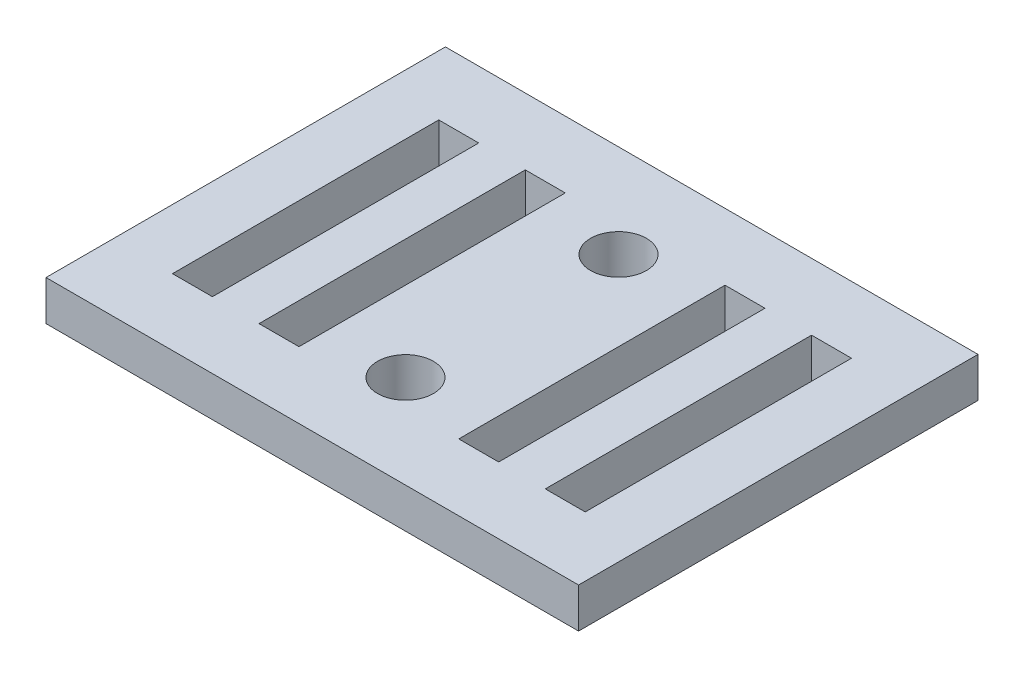
ISO-10303-21;
HEADER;
FILE_DESCRIPTION(('STEP AP214'),'2;1');
FILE_NAME('part.step','',(''),(''),'','','');
FILE_SCHEMA(('AUTOMOTIVE_DESIGN { 1 0 10303 214 1 1 1 1 }'));
ENDSEC;
DATA;
#1=APPLICATION_CONTEXT('core data for automotive mechanical design processes');
#2=APPLICATION_PROTOCOL_DEFINITION('international standard','automotive_design',2000,#1);
#3=PRODUCT_CONTEXT('',#1,'mechanical');
#4=PRODUCT('Part','Part','',(#3));
#5=PRODUCT_RELATED_PRODUCT_CATEGORY('part','',(#4));
#6=PRODUCT_DEFINITION_FORMATION('','',#4);
#7=PRODUCT_DEFINITION_CONTEXT('part definition',#1,'design');
#8=PRODUCT_DEFINITION('design','',#6,#7);
#9=PRODUCT_DEFINITION_SHAPE('','',#8);
#10=(LENGTH_UNIT() NAMED_UNIT(*) SI_UNIT(.MILLI.,.METRE.));
#11=(NAMED_UNIT(*) PLANE_ANGLE_UNIT() SI_UNIT($,.RADIAN.));
#12=(NAMED_UNIT(*) SI_UNIT($,.STERADIAN.) SOLID_ANGLE_UNIT());
#13=UNCERTAINTY_MEASURE_WITH_UNIT(LENGTH_MEASURE(1.E-05),#10,'distance_accuracy_value','');
#14=(GEOMETRIC_REPRESENTATION_CONTEXT(3) GLOBAL_UNCERTAINTY_ASSIGNED_CONTEXT((#13)) GLOBAL_UNIT_ASSIGNED_CONTEXT((#10,
#11,#12)) REPRESENTATION_CONTEXT('',''));
#15=CARTESIAN_POINT('',(0.,0.,0.));
#16=DIRECTION('',(0.,0.,1.));
#17=DIRECTION('',(1.,0.,0.));
#18=AXIS2_PLACEMENT_3D('',#15,#16,#17);
#19=CARTESIAN_POINT('',(0.,3.,25.0000000000001));
#20=DIRECTION('',(0.,0.,1.));
#21=DIRECTION('',(1.,0.,0.));
#22=AXIS2_PLACEMENT_3D('',#19,#20,#21);
#23=PLANE('',#22);
#24=DIRECTION('',(-1.,0.,0.));
#25=VECTOR('',#24,1.);
#26=CARTESIAN_POINT('',(0.,0.,25.0000000000001));
#27=LINE('',#26,#25);
#28=CARTESIAN_POINT('',(35.5,0.,25.));
#29=VERTEX_POINT('',#28);
#30=CARTESIAN_POINT('',(32.5,0.,25.));
#31=VERTEX_POINT('',#30);
#32=EDGE_CURVE('E287',#29,#31,#27,.T.);
#33=ORIENTED_EDGE('',*,*,#32,.T.);
#34=DIRECTION('',(0.,-1.,0.));
#35=VECTOR('',#34,1.);
#36=CARTESIAN_POINT('',(32.5,3.,25.));
#37=LINE('',#36,#35);
#38=CARTESIAN_POINT('',(32.5,3.,25.));
#39=VERTEX_POINT('',#38);
#40=EDGE_CURVE('E11',#39,#31,#37,.T.);
#41=ORIENTED_EDGE('',*,*,#40,.F.);
#42=DIRECTION('',(-1.,0.,0.));
#43=VECTOR('',#42,1.);
#44=CARTESIAN_POINT('',(0.,3.,25.0000000000001));
#45=LINE('',#44,#43);
#46=CARTESIAN_POINT('',(35.5,3.,25.));
#47=VERTEX_POINT('',#46);
#48=EDGE_CURVE('E204',#47,#39,#45,.T.);
#49=ORIENTED_EDGE('',*,*,#48,.F.);
#50=DIRECTION('',(0.,-1.,0.));
#51=VECTOR('',#50,1.);
#52=CARTESIAN_POINT('',(35.5,3.,25.));
#53=LINE('',#52,#51);
#54=EDGE_CURVE('E299',#47,#29,#53,.T.);
#55=ORIENTED_EDGE('',*,*,#54,.T.);
#56=EDGE_LOOP('',(#33,#41,#49,#55));
#57=FACE_BOUND('',#56,.T.);
#58=ADVANCED_FACE('F45',(#57),#23,.F.);
#59=CARTESIAN_POINT('',(32.5,3.,0.));
#60=DIRECTION('',(1.,0.,0.));
#61=DIRECTION('',(0.,0.,-1.));
#62=AXIS2_PLACEMENT_3D('',#59,#60,#61);
#63=PLANE('',#62);
#64=DIRECTION('',(0.,0.,1.));
#65=VECTOR('',#64,1.);
#66=CARTESIAN_POINT('',(32.5,0.,0.));
#67=LINE('',#66,#65);
#68=CARTESIAN_POINT('',(32.5,0.,5.));
#69=VERTEX_POINT('',#68);
#70=EDGE_CURVE('E194',#69,#31,#67,.T.);
#71=ORIENTED_EDGE('',*,*,#70,.F.);
#72=DIRECTION('',(0.,-1.,0.));
#73=VECTOR('',#72,1.);
#74=CARTESIAN_POINT('',(32.5,3.,5.));
#75=LINE('',#74,#73);
#76=CARTESIAN_POINT('',(32.5,3.,5.));
#77=VERTEX_POINT('',#76);
#78=EDGE_CURVE('E56',#77,#69,#75,.T.);
#79=ORIENTED_EDGE('',*,*,#78,.F.);
#80=DIRECTION('',(0.,0.,1.));
#81=VECTOR('',#80,1.);
#82=CARTESIAN_POINT('',(32.5,3.,0.));
#83=LINE('',#82,#81);
#84=EDGE_CURVE('E192',#77,#39,#83,.T.);
#85=ORIENTED_EDGE('',*,*,#84,.T.);
#86=ORIENTED_EDGE('',*,*,#40,.T.);
#87=EDGE_LOOP('',(#71,#79,#85,#86));
#88=FACE_BOUND('',#87,.T.);
#89=ADVANCED_FACE('F191',(#88),#63,.T.);
#90=CARTESIAN_POINT('',(0.,3.,5.));
#91=DIRECTION('',(0.,0.,1.));
#92=DIRECTION('',(1.,0.,0.));
#93=AXIS2_PLACEMENT_3D('',#90,#91,#92);
#94=PLANE('',#93);
#95=DIRECTION('',(-1.,0.,0.));
#96=VECTOR('',#95,1.);
#97=CARTESIAN_POINT('',(0.,0.,5.));
#98=LINE('',#97,#96);
#99=CARTESIAN_POINT('',(35.5,0.,5.));
#100=VERTEX_POINT('',#99);
#101=EDGE_CURVE('E293',#100,#69,#98,.T.);
#102=ORIENTED_EDGE('',*,*,#101,.F.);
#103=DIRECTION('',(0.,-1.,0.));
#104=VECTOR('',#103,1.);
#105=CARTESIAN_POINT('',(35.5,3.,5.));
#106=LINE('',#105,#104);
#107=CARTESIAN_POINT('',(35.5,3.,5.));
#108=VERTEX_POINT('',#107);
#109=EDGE_CURVE('E128',#108,#100,#106,.T.);
#110=ORIENTED_EDGE('',*,*,#109,.F.);
#111=DIRECTION('',(-1.,0.,0.));
#112=VECTOR('',#111,1.);
#113=CARTESIAN_POINT('',(0.,3.,5.));
#114=LINE('',#113,#112);
#115=EDGE_CURVE('E202',#108,#77,#114,.T.);
#116=ORIENTED_EDGE('',*,*,#115,.T.);
#117=ORIENTED_EDGE('',*,*,#78,.T.);
#118=EDGE_LOOP('',(#102,#110,#116,#117));
#119=FACE_BOUND('',#118,.T.);
#120=ADVANCED_FACE('F208',(#119),#94,.T.);
#121=CARTESIAN_POINT('',(0.,3.,25.));
#122=DIRECTION('',(0.,0.,1.));
#123=DIRECTION('',(1.,0.,0.));
#124=AXIS2_PLACEMENT_3D('',#121,#122,#123);
#125=PLANE('',#124);
#126=DIRECTION('',(-1.,0.,0.));
#127=VECTOR('',#126,1.);
#128=CARTESIAN_POINT('',(0.,0.,25.));
#129=LINE('',#128,#127);
#130=CARTESIAN_POINT('',(29.,0.,25.));
#131=VERTEX_POINT('',#130);
#132=CARTESIAN_POINT('',(26.,0.,25.));
#133=VERTEX_POINT('',#132);
#134=EDGE_CURVE('E272',#131,#133,#129,.T.);
#135=ORIENTED_EDGE('',*,*,#134,.T.);
#136=DIRECTION('',(0.,-1.,0.));
#137=VECTOR('',#136,1.);
#138=CARTESIAN_POINT('',(26.,3.,25.));
#139=LINE('',#138,#137);
#140=CARTESIAN_POINT('',(26.,3.,25.));
#141=VERTEX_POINT('',#140);
#142=EDGE_CURVE('E302',#141,#133,#139,.T.);
#143=ORIENTED_EDGE('',*,*,#142,.F.);
#144=DIRECTION('',(-1.,0.,0.));
#145=VECTOR('',#144,1.);
#146=CARTESIAN_POINT('',(0.,3.,25.));
#147=LINE('',#146,#145);
#148=CARTESIAN_POINT('',(29.,3.,25.));
#149=VERTEX_POINT('',#148);
#150=EDGE_CURVE('E413',#149,#141,#147,.T.);
#151=ORIENTED_EDGE('',*,*,#150,.F.);
#152=DIRECTION('',(0.,-1.,0.));
#153=VECTOR('',#152,1.);
#154=CARTESIAN_POINT('',(29.,3.,25.));
#155=LINE('',#154,#153);
#156=EDGE_CURVE('E305',#149,#131,#155,.T.);
#157=ORIENTED_EDGE('',*,*,#156,.T.);
#158=EDGE_LOOP('',(#135,#143,#151,#157));
#159=FACE_BOUND('',#158,.T.);
#160=ADVANCED_FACE('F439',(#159),#125,.F.);
#161=CARTESIAN_POINT('',(26.,3.,0.));
#162=DIRECTION('',(1.,0.,0.));
#163=DIRECTION('',(0.,0.,-1.));
#164=AXIS2_PLACEMENT_3D('',#161,#162,#163);
#165=PLANE('',#164);
#166=DIRECTION('',(0.,0.,1.));
#167=VECTOR('',#166,1.);
#168=CARTESIAN_POINT('',(26.,0.,0.));
#169=LINE('',#168,#167);
#170=CARTESIAN_POINT('',(26.,0.,5.));
#171=VERTEX_POINT('',#170);
#172=EDGE_CURVE('E276',#171,#133,#169,.T.);
#173=ORIENTED_EDGE('',*,*,#172,.F.);
#174=DIRECTION('',(0.,-1.,0.));
#175=VECTOR('',#174,1.);
#176=CARTESIAN_POINT('',(26.,3.,5.));
#177=LINE('',#176,#175);
#178=CARTESIAN_POINT('',(26.,3.,5.));
#179=VERTEX_POINT('',#178);
#180=EDGE_CURVE('E313',#179,#171,#177,.T.);
#181=ORIENTED_EDGE('',*,*,#180,.F.);
#182=DIRECTION('',(0.,0.,1.));
#183=VECTOR('',#182,1.);
#184=CARTESIAN_POINT('',(26.,3.,0.));
#185=LINE('',#184,#183);
#186=EDGE_CURVE('E416',#179,#141,#185,.T.);
#187=ORIENTED_EDGE('',*,*,#186,.T.);
#188=ORIENTED_EDGE('',*,*,#142,.T.);
#189=EDGE_LOOP('',(#173,#181,#187,#188));
#190=FACE_BOUND('',#189,.T.);
#191=ADVANCED_FACE('F442',(#190),#165,.T.);
#192=CARTESIAN_POINT('',(0.,3.,5.));
#193=DIRECTION('',(0.,0.,1.));
#194=DIRECTION('',(1.,0.,0.));
#195=AXIS2_PLACEMENT_3D('',#192,#193,#194);
#196=PLANE('',#195);
#197=DIRECTION('',(-1.,0.,0.));
#198=VECTOR('',#197,1.);
#199=CARTESIAN_POINT('',(0.,0.,5.));
#200=LINE('',#199,#198);
#201=CARTESIAN_POINT('',(29.,0.,5.));
#202=VERTEX_POINT('',#201);
#203=EDGE_CURVE('E280',#202,#171,#200,.T.);
#204=ORIENTED_EDGE('',*,*,#203,.F.);
#205=DIRECTION('',(0.,-1.,0.));
#206=VECTOR('',#205,1.);
#207=CARTESIAN_POINT('',(29.,3.,5.));
#208=LINE('',#207,#206);
#209=CARTESIAN_POINT('',(29.,3.,5.));
#210=VERTEX_POINT('',#209);
#211=EDGE_CURVE('E309',#210,#202,#208,.T.);
#212=ORIENTED_EDGE('',*,*,#211,.F.);
#213=DIRECTION('',(-1.,0.,0.));
#214=VECTOR('',#213,1.);
#215=CARTESIAN_POINT('',(0.,3.,5.));
#216=LINE('',#215,#214);
#217=EDGE_CURVE('E420',#210,#179,#216,.T.);
#218=ORIENTED_EDGE('',*,*,#217,.T.);
#219=ORIENTED_EDGE('',*,*,#180,.T.);
#220=EDGE_LOOP('',(#204,#212,#218,#219));
#221=FACE_BOUND('',#220,.T.);
#222=ADVANCED_FACE('F445',(#221),#196,.T.);
#223=CARTESIAN_POINT('',(0.,3.,5.));
#224=DIRECTION('',(0.,0.,-1.));
#225=DIRECTION('',(-1.,0.,0.));
#226=AXIS2_PLACEMENT_3D('',#223,#224,#225);
#227=PLANE('',#226);
#228=DIRECTION('',(1.,0.,0.));
#229=VECTOR('',#228,1.);
#230=CARTESIAN_POINT('',(0.,0.,5.));
#231=LINE('',#230,#229);
#232=CARTESIAN_POINT('',(4.5,0.,5.));
#233=VERTEX_POINT('',#232);
#234=CARTESIAN_POINT('',(7.5,0.,5.));
#235=VERTEX_POINT('',#234);
#236=EDGE_CURVE('E256',#233,#235,#231,.T.);
#237=ORIENTED_EDGE('',*,*,#236,.T.);
#238=DIRECTION('',(0.,-1.,0.));
#239=VECTOR('',#238,1.);
#240=CARTESIAN_POINT('',(7.5,3.,5.));
#241=LINE('',#240,#239);
#242=CARTESIAN_POINT('',(7.5,3.,5.));
#243=VERTEX_POINT('',#242);
#244=EDGE_CURVE('E310',#243,#235,#241,.T.);
#245=ORIENTED_EDGE('',*,*,#244,.F.);
#246=DIRECTION('',(1.,0.,0.));
#247=VECTOR('',#246,1.);
#248=CARTESIAN_POINT('',(0.,3.,5.));
#249=LINE('',#248,#247);
#250=CARTESIAN_POINT('',(4.5,3.,5.));
#251=VERTEX_POINT('',#250);
#252=EDGE_CURVE('E398',#251,#243,#249,.T.);
#253=ORIENTED_EDGE('',*,*,#252,.F.);
#254=DIRECTION('',(0.,-1.,0.));
#255=VECTOR('',#254,1.);
#256=CARTESIAN_POINT('',(4.5,3.,5.));
#257=LINE('',#256,#255);
#258=EDGE_CURVE('E318',#251,#233,#257,.T.);
#259=ORIENTED_EDGE('',*,*,#258,.T.);
#260=EDGE_LOOP('',(#237,#245,#253,#259));
#261=FACE_BOUND('',#260,.T.);
#262=ADVANCED_FACE('F477',(#261),#227,.F.);
#263=CARTESIAN_POINT('',(7.5,3.,0.));
#264=DIRECTION('',(1.,0.,0.));
#265=DIRECTION('',(0.,0.,-1.));
#266=AXIS2_PLACEMENT_3D('',#263,#264,#265);
#267=PLANE('',#266);
#268=DIRECTION('',(0.,0.,1.));
#269=VECTOR('',#268,1.);
#270=CARTESIAN_POINT('',(7.5,0.,0.));
#271=LINE('',#270,#269);
#272=CARTESIAN_POINT('',(7.5,0.,25.));
#273=VERTEX_POINT('',#272);
#274=EDGE_CURVE('E260',#235,#273,#271,.T.);
#275=ORIENTED_EDGE('',*,*,#274,.T.);
#276=DIRECTION('',(0.,-1.,0.));
#277=VECTOR('',#276,1.);
#278=CARTESIAN_POINT('',(7.5,3.,25.));
#279=LINE('',#278,#277);
#280=CARTESIAN_POINT('',(7.5,3.,25.));
#281=VERTEX_POINT('',#280);
#282=EDGE_CURVE('E325',#281,#273,#279,.T.);
#283=ORIENTED_EDGE('',*,*,#282,.F.);
#284=DIRECTION('',(0.,0.,1.));
#285=VECTOR('',#284,1.);
#286=CARTESIAN_POINT('',(7.5,3.,0.));
#287=LINE('',#286,#285);
#288=EDGE_CURVE('E402',#243,#281,#287,.T.);
#289=ORIENTED_EDGE('',*,*,#288,.F.);
#290=ORIENTED_EDGE('',*,*,#244,.T.);
#291=EDGE_LOOP('',(#275,#283,#289,#290));
#292=FACE_BOUND('',#291,.T.);
#293=ADVANCED_FACE('F490',(#292),#267,.F.);
#294=CARTESIAN_POINT('',(0.,3.,25.));
#295=DIRECTION('',(0.,0.,-1.));
#296=DIRECTION('',(-1.,0.,0.));
#297=AXIS2_PLACEMENT_3D('',#294,#295,#296);
#298=PLANE('',#297);
#299=DIRECTION('',(1.,0.,0.));
#300=VECTOR('',#299,1.);
#301=CARTESIAN_POINT('',(0.,0.,25.));
#302=LINE('',#301,#300);
#303=CARTESIAN_POINT('',(4.5,0.,25.));
#304=VERTEX_POINT('',#303);
#305=EDGE_CURVE('E264',#304,#273,#302,.T.);
#306=ORIENTED_EDGE('',*,*,#305,.F.);
#307=DIRECTION('',(0.,-1.,0.));
#308=VECTOR('',#307,1.);
#309=CARTESIAN_POINT('',(4.5,3.,25.));
#310=LINE('',#309,#308);
#311=CARTESIAN_POINT('',(4.5,3.,25.));
#312=VERTEX_POINT('',#311);
#313=EDGE_CURVE('E321',#312,#304,#310,.T.);
#314=ORIENTED_EDGE('',*,*,#313,.F.);
#315=DIRECTION('',(1.,0.,0.));
#316=VECTOR('',#315,1.);
#317=CARTESIAN_POINT('',(0.,3.,25.));
#318=LINE('',#317,#316);
#319=EDGE_CURVE('E405',#312,#281,#318,.T.);
#320=ORIENTED_EDGE('',*,*,#319,.T.);
#321=ORIENTED_EDGE('',*,*,#282,.T.);
#322=EDGE_LOOP('',(#306,#314,#320,#321));
#323=FACE_BOUND('',#322,.T.);
#324=ADVANCED_FACE('F486',(#323),#298,.T.);
#325=CARTESIAN_POINT('',(11.,3.,0.));
#326=DIRECTION('',(1.,0.,0.));
#327=DIRECTION('',(0.,0.,-1.));
#328=AXIS2_PLACEMENT_3D('',#325,#326,#327);
#329=PLANE('',#328);
#330=DIRECTION('',(0.,0.,1.));
#331=VECTOR('',#330,1.);
#332=CARTESIAN_POINT('',(11.,0.,0.));
#333=LINE('',#332,#331);
#334=CARTESIAN_POINT('',(11.,0.,5.));
#335=VERTEX_POINT('',#334);
#336=CARTESIAN_POINT('',(11.,0.,25.));
#337=VERTEX_POINT('',#336);
#338=EDGE_CURVE('E240',#335,#337,#333,.T.);
#339=ORIENTED_EDGE('',*,*,#338,.F.);
#340=DIRECTION('',(0.,-1.,0.));
#341=VECTOR('',#340,1.);
#342=CARTESIAN_POINT('',(11.,3.,5.));
#343=LINE('',#342,#341);
#344=CARTESIAN_POINT('',(11.,3.,5.));
#345=VERTEX_POINT('',#344);
#346=EDGE_CURVE('E322',#345,#335,#343,.T.);
#347=ORIENTED_EDGE('',*,*,#346,.F.);
#348=DIRECTION('',(0.,0.,1.));
#349=VECTOR('',#348,1.);
#350=CARTESIAN_POINT('',(11.,3.,0.));
#351=LINE('',#350,#349);
#352=CARTESIAN_POINT('',(11.,3.,25.));
#353=VERTEX_POINT('',#352);
#354=EDGE_CURVE('E374',#345,#353,#351,.T.);
#355=ORIENTED_EDGE('',*,*,#354,.T.);
#356=DIRECTION('',(0.,-1.,0.));
#357=VECTOR('',#356,1.);
#358=CARTESIAN_POINT('',(11.,3.,25.));
#359=LINE('',#358,#357);
#360=EDGE_CURVE('E331',#353,#337,#359,.T.);
#361=ORIENTED_EDGE('',*,*,#360,.T.);
#362=EDGE_LOOP('',(#339,#347,#355,#361));
#363=FACE_BOUND('',#362,.T.);
#364=ADVANCED_FACE('F489',(#363),#329,.T.);
#365=CARTESIAN_POINT('',(0.,3.,5.));
#366=DIRECTION('',(0.,0.,-1.));
#367=DIRECTION('',(-1.,0.,0.));
#368=AXIS2_PLACEMENT_3D('',#365,#366,#367);
#369=PLANE('',#368);
#370=DIRECTION('',(1.,0.,0.));
#371=VECTOR('',#370,1.);
#372=CARTESIAN_POINT('',(0.,0.,5.));
#373=LINE('',#372,#371);
#374=CARTESIAN_POINT('',(14.,0.,5.));
#375=VERTEX_POINT('',#374);
#376=EDGE_CURVE('E244',#335,#375,#373,.T.);
#377=ORIENTED_EDGE('',*,*,#376,.T.);
#378=DIRECTION('',(0.,-1.,0.));
#379=VECTOR('',#378,1.);
#380=CARTESIAN_POINT('',(14.,3.,5.));
#381=LINE('',#380,#379);
#382=CARTESIAN_POINT('',(14.,3.,5.));
#383=VERTEX_POINT('',#382);
#384=EDGE_CURVE('E337',#383,#375,#381,.T.);
#385=ORIENTED_EDGE('',*,*,#384,.F.);
#386=DIRECTION('',(1.,0.,0.));
#387=VECTOR('',#386,1.);
#388=CARTESIAN_POINT('',(0.,3.,5.));
#389=LINE('',#388,#387);
#390=EDGE_CURVE('E387',#345,#383,#389,.T.);
#391=ORIENTED_EDGE('',*,*,#390,.F.);
#392=ORIENTED_EDGE('',*,*,#346,.T.);
#393=EDGE_LOOP('',(#377,#385,#391,#392));
#394=FACE_BOUND('',#393,.T.);
#395=ADVANCED_FACE('F504',(#394),#369,.F.);
#396=CARTESIAN_POINT('',(14.,3.,0.));
#397=DIRECTION('',(1.,0.,0.));
#398=DIRECTION('',(0.,0.,-1.));
#399=AXIS2_PLACEMENT_3D('',#396,#397,#398);
#400=PLANE('',#399);
#401=DIRECTION('',(0.,0.,1.));
#402=VECTOR('',#401,1.);
#403=CARTESIAN_POINT('',(14.,0.,0.));
#404=LINE('',#403,#402);
#405=CARTESIAN_POINT('',(14.,0.,25.));
#406=VERTEX_POINT('',#405);
#407=EDGE_CURVE('E248',#375,#406,#404,.T.);
#408=ORIENTED_EDGE('',*,*,#407,.T.);
#409=DIRECTION('',(0.,-1.,0.));
#410=VECTOR('',#409,1.);
#411=CARTESIAN_POINT('',(14.,3.,25.));
#412=LINE('',#411,#410);
#413=CARTESIAN_POINT('',(14.,3.,25.));
#414=VERTEX_POINT('',#413);
#415=EDGE_CURVE('E334',#414,#406,#412,.T.);
#416=ORIENTED_EDGE('',*,*,#415,.F.);
#417=DIRECTION('',(0.,0.,1.));
#418=VECTOR('',#417,1.);
#419=CARTESIAN_POINT('',(14.,3.,0.));
#420=LINE('',#419,#418);
#421=EDGE_CURVE('E391',#383,#414,#420,.T.);
#422=ORIENTED_EDGE('',*,*,#421,.F.);
#423=ORIENTED_EDGE('',*,*,#384,.T.);
#424=EDGE_LOOP('',(#408,#416,#422,#423));
#425=FACE_BOUND('',#424,.T.);
#426=ADVANCED_FACE('F501',(#425),#400,.F.);
#427=CARTESIAN_POINT('',(40.,3.,0.));
#428=DIRECTION('',(1.,0.,0.));
#429=DIRECTION('',(0.,0.,-1.));
#430=AXIS2_PLACEMENT_3D('',#427,#428,#429);
#431=PLANE('',#430);
#432=DIRECTION('',(0.,0.,1.));
#433=VECTOR('',#432,1.);
#434=CARTESIAN_POINT('',(40.,0.,0.));
#435=LINE('',#434,#433);
#436=CARTESIAN_POINT('',(40.,0.,0.));
#437=VERTEX_POINT('',#436);
#438=CARTESIAN_POINT('',(40.,0.,30.));
#439=VERTEX_POINT('',#438);
#440=EDGE_CURVE('E224',#437,#439,#435,.T.);
#441=ORIENTED_EDGE('',*,*,#440,.F.);
#442=DIRECTION('',(0.,-1.,0.));
#443=VECTOR('',#442,1.);
#444=CARTESIAN_POINT('',(40.,3.,0.));
#445=LINE('',#444,#443);
#446=CARTESIAN_POINT('',(40.,3.,0.));
#447=VERTEX_POINT('',#446);
#448=EDGE_CURVE('E49',#447,#437,#445,.T.);
#449=ORIENTED_EDGE('',*,*,#448,.F.);
#450=DIRECTION('',(0.,0.,1.));
#451=VECTOR('',#450,1.);
#452=CARTESIAN_POINT('',(40.,3.,0.));
#453=LINE('',#452,#451);
#454=CARTESIAN_POINT('',(40.,3.,30.));
#455=VERTEX_POINT('',#454);
#456=EDGE_CURVE('E380',#447,#455,#453,.T.);
#457=ORIENTED_EDGE('',*,*,#456,.T.);
#458=DIRECTION('',(0.,-1.,0.));
#459=VECTOR('',#458,1.);
#460=CARTESIAN_POINT('',(40.,3.,30.));
#461=LINE('',#460,#459);
#462=EDGE_CURVE('E212',#455,#439,#461,.T.);
#463=ORIENTED_EDGE('',*,*,#462,.T.);
#464=EDGE_LOOP('',(#441,#449,#457,#463));
#465=FACE_BOUND('',#464,.T.);
#466=ADVANCED_FACE('F360',(#465),#431,.T.);
#467=CARTESIAN_POINT('',(0.,3.,0.));
#468=DIRECTION('',(0.,0.,-1.));
#469=DIRECTION('',(-1.,0.,0.));
#470=AXIS2_PLACEMENT_3D('',#467,#468,#469);
#471=PLANE('',#470);
#472=DIRECTION('',(1.,0.,0.));
#473=VECTOR('',#472,1.);
#474=CARTESIAN_POINT('',(0.,0.,0.));
#475=LINE('',#474,#473);
#476=CARTESIAN_POINT('',(0.,0.,0.));
#477=VERTEX_POINT('',#476);
#478=EDGE_CURVE('E228',#477,#437,#475,.T.);
#479=ORIENTED_EDGE('',*,*,#478,.F.);
#480=DIRECTION('',(0.,-1.,0.));
#481=VECTOR('',#480,1.);
#482=CARTESIAN_POINT('',(0.,3.,0.));
#483=LINE('',#482,#481);
#484=CARTESIAN_POINT('',(0.,3.,0.));
#485=VERTEX_POINT('',#484);
#486=EDGE_CURVE('E348',#485,#477,#483,.T.);
#487=ORIENTED_EDGE('',*,*,#486,.F.);
#488=DIRECTION('',(1.,0.,0.));
#489=VECTOR('',#488,1.);
#490=CARTESIAN_POINT('',(0.,3.,0.));
#491=LINE('',#490,#489);
#492=EDGE_CURVE('E359',#485,#447,#491,.T.);
#493=ORIENTED_EDGE('',*,*,#492,.T.);
#494=ORIENTED_EDGE('',*,*,#448,.T.);
#495=EDGE_LOOP('',(#479,#487,#493,#494));
#496=FACE_BOUND('',#495,.T.);
#497=ADVANCED_FACE('F357',(#496),#471,.T.);
#498=CARTESIAN_POINT('',(0.,3.,0.));
#499=DIRECTION('',(1.,0.,0.));
#500=DIRECTION('',(0.,0.,-1.));
#501=AXIS2_PLACEMENT_3D('',#498,#499,#500);
#502=PLANE('',#501);
#503=DIRECTION('',(0.,0.,1.));
#504=VECTOR('',#503,1.);
#505=CARTESIAN_POINT('',(0.,0.,0.));
#506=LINE('',#505,#504);
#507=CARTESIAN_POINT('',(0.,0.,30.));
#508=VERTEX_POINT('',#507);
#509=EDGE_CURVE('E232',#477,#508,#506,.T.);
#510=ORIENTED_EDGE('',*,*,#509,.T.);
#511=DIRECTION('',(0.,-1.,0.));
#512=VECTOR('',#511,1.);
#513=CARTESIAN_POINT('',(0.,3.,30.));
#514=LINE('',#513,#512);
#515=CARTESIAN_POINT('',(0.,3.,30.));
#516=VERTEX_POINT('',#515);
#517=EDGE_CURVE('E345',#516,#508,#514,.T.);
#518=ORIENTED_EDGE('',*,*,#517,.F.);
#519=DIRECTION('',(0.,0.,1.));
#520=VECTOR('',#519,1.);
#521=CARTESIAN_POINT('',(0.,3.,0.));
#522=LINE('',#521,#520);
#523=EDGE_CURVE('E368',#485,#516,#522,.T.);
#524=ORIENTED_EDGE('',*,*,#523,.F.);
#525=ORIENTED_EDGE('',*,*,#486,.T.);
#526=EDGE_LOOP('',(#510,#518,#524,#525));
#527=FACE_BOUND('',#526,.T.);
#528=ADVANCED_FACE('F366',(#527),#502,.F.);
#529=CARTESIAN_POINT('',(29.,3.,0.));
#530=DIRECTION('',(1.,0.,0.));
#531=DIRECTION('',(0.,0.,-1.));
#532=AXIS2_PLACEMENT_3D('',#529,#530,#531);
#533=PLANE('',#532);
#534=DIRECTION('',(0.,0.,1.));
#535=VECTOR('',#534,1.);
#536=CARTESIAN_POINT('',(29.,0.,0.));
#537=LINE('',#536,#535);
#538=EDGE_CURVE('E284',#202,#131,#537,.T.);
#539=ORIENTED_EDGE('',*,*,#538,.T.);
#540=ORIENTED_EDGE('',*,*,#156,.F.);
#541=DIRECTION('',(0.,0.,1.));
#542=VECTOR('',#541,1.);
#543=CARTESIAN_POINT('',(29.,3.,0.));
#544=LINE('',#543,#542);
#545=EDGE_CURVE('E424',#210,#149,#544,.T.);
#546=ORIENTED_EDGE('',*,*,#545,.F.);
#547=ORIENTED_EDGE('',*,*,#211,.T.);
#548=EDGE_LOOP('',(#539,#540,#546,#547));
#549=FACE_BOUND('',#548,.T.);
#550=ADVANCED_FACE('F435',(#549),#533,.F.);
#551=CARTESIAN_POINT('',(4.5,3.,0.));
#552=DIRECTION('',(1.,0.,0.));
#553=DIRECTION('',(0.,0.,-1.));
#554=AXIS2_PLACEMENT_3D('',#551,#552,#553);
#555=PLANE('',#554);
#556=DIRECTION('',(0.,0.,1.));
#557=VECTOR('',#556,1.);
#558=CARTESIAN_POINT('',(4.5,0.,0.));
#559=LINE('',#558,#557);
#560=EDGE_CURVE('E268',#233,#304,#559,.T.);
#561=ORIENTED_EDGE('',*,*,#560,.F.);
#562=ORIENTED_EDGE('',*,*,#258,.F.);
#563=DIRECTION('',(0.,0.,1.));
#564=VECTOR('',#563,1.);
#565=CARTESIAN_POINT('',(4.5,3.,0.));
#566=LINE('',#565,#564);
#567=EDGE_CURVE('E409',#251,#312,#566,.T.);
#568=ORIENTED_EDGE('',*,*,#567,.T.);
#569=ORIENTED_EDGE('',*,*,#313,.T.);
#570=EDGE_LOOP('',(#561,#562,#568,#569));
#571=FACE_BOUND('',#570,.T.);
#572=ADVANCED_FACE('F474',(#571),#555,.T.);
#573=CARTESIAN_POINT('',(0.,3.,25.));
#574=DIRECTION('',(0.,0.,-1.));
#575=DIRECTION('',(-1.,0.,0.));
#576=AXIS2_PLACEMENT_3D('',#573,#574,#575);
#577=PLANE('',#576);
#578=DIRECTION('',(1.,0.,0.));
#579=VECTOR('',#578,1.);
#580=CARTESIAN_POINT('',(0.,0.,25.));
#581=LINE('',#580,#579);
#582=EDGE_CURVE('E252',#337,#406,#581,.T.);
#583=ORIENTED_EDGE('',*,*,#582,.F.);
#584=ORIENTED_EDGE('',*,*,#360,.F.);
#585=DIRECTION('',(1.,0.,0.));
#586=VECTOR('',#585,1.);
#587=CARTESIAN_POINT('',(0.,3.,25.));
#588=LINE('',#587,#586);
#589=EDGE_CURVE('E394',#353,#414,#588,.T.);
#590=ORIENTED_EDGE('',*,*,#589,.T.);
#591=ORIENTED_EDGE('',*,*,#415,.T.);
#592=EDGE_LOOP('',(#583,#584,#590,#591));
#593=FACE_BOUND('',#592,.T.);
#594=ADVANCED_FACE('F484',(#593),#577,.T.);
#595=CARTESIAN_POINT('',(0.,3.,30.));
#596=DIRECTION('',(0.,0.,-1.));
#597=DIRECTION('',(-1.,0.,0.));
#598=AXIS2_PLACEMENT_3D('',#595,#596,#597);
#599=PLANE('',#598);
#600=DIRECTION('',(1.,0.,0.));
#601=VECTOR('',#600,1.);
#602=CARTESIAN_POINT('',(0.,0.,30.));
#603=LINE('',#602,#601);
#604=EDGE_CURVE('E236',#508,#439,#603,.T.);
#605=ORIENTED_EDGE('',*,*,#604,.T.);
#606=ORIENTED_EDGE('',*,*,#462,.F.);
#607=DIRECTION('',(1.,0.,0.));
#608=VECTOR('',#607,1.);
#609=CARTESIAN_POINT('',(0.,3.,30.));
#610=LINE('',#609,#608);
#611=EDGE_CURVE('E371',#516,#455,#610,.T.);
#612=ORIENTED_EDGE('',*,*,#611,.F.);
#613=ORIENTED_EDGE('',*,*,#517,.T.);
#614=EDGE_LOOP('',(#605,#606,#612,#613));
#615=FACE_BOUND('',#614,.T.);
#616=ADVANCED_FACE('F370',(#615),#599,.F.);
#617=CARTESIAN_POINT('',(20.,3.,7.));
#618=DIRECTION('',(0.,-1.,0.));
#619=DIRECTION('',(0.,0.,-1.));
#620=AXIS2_PLACEMENT_3D('',#617,#618,#619);
#621=CYLINDRICAL_SURFACE('',#620,2.1);
#622=CARTESIAN_POINT('',(20.,3.,7.));
#623=DIRECTION('',(0.,1.,0.));
#624=DIRECTION('',(0.,0.,1.));
#625=AXIS2_PLACEMENT_3D('',#622,#623,#624);
#626=CIRCLE('',#625,2.1);
#627=CARTESIAN_POINT('',(20.,3.,9.1));
#628=VERTEX_POINT('',#627);
#629=EDGE_CURVE('E526',#628,#628,#626,.F.);
#630=ORIENTED_EDGE('',*,*,#629,.F.);
#631=EDGE_LOOP('',(#630));
#632=FACE_BOUND('',#631,.T.);
#633=CARTESIAN_POINT('',(20.,0.,7.));
#634=DIRECTION('',(0.,1.,0.));
#635=DIRECTION('',(0.,0.,1.));
#636=AXIS2_PLACEMENT_3D('',#633,#634,#635);
#637=CIRCLE('',#636,2.1);
#638=CARTESIAN_POINT('',(20.,0.,9.1));
#639=VERTEX_POINT('',#638);
#640=EDGE_CURVE('E220',#639,#639,#637,.F.);
#641=ORIENTED_EDGE('',*,*,#640,.T.);
#642=EDGE_LOOP('',(#641));
#643=FACE_BOUND('',#642,.T.);
#644=ADVANCED_FACE('F462',(#632,#643),#621,.F.);
#645=CARTESIAN_POINT('',(20.,3.,23.));
#646=DIRECTION('',(0.,-1.,0.));
#647=DIRECTION('',(0.,0.,-1.));
#648=AXIS2_PLACEMENT_3D('',#645,#646,#647);
#649=CYLINDRICAL_SURFACE('',#648,2.1);
#650=CARTESIAN_POINT('',(20.,3.,23.));
#651=DIRECTION('',(0.,1.,0.));
#652=DIRECTION('',(0.,0.,1.));
#653=AXIS2_PLACEMENT_3D('',#650,#651,#652);
#654=CIRCLE('',#653,2.1);
#655=CARTESIAN_POINT('',(20.,3.,25.1));
#656=VERTEX_POINT('',#655);
#657=EDGE_CURVE('E298',#656,#656,#654,.T.);
#658=ORIENTED_EDGE('',*,*,#657,.T.);
#659=EDGE_LOOP('',(#658));
#660=FACE_BOUND('',#659,.T.);
#661=CARTESIAN_POINT('',(20.,0.,23.));
#662=DIRECTION('',(0.,1.,0.));
#663=DIRECTION('',(0.,0.,1.));
#664=AXIS2_PLACEMENT_3D('',#661,#662,#663);
#665=CIRCLE('',#664,2.1);
#666=CARTESIAN_POINT('',(20.,0.,25.1));
#667=VERTEX_POINT('',#666);
#668=EDGE_CURVE('E216',#667,#667,#665,.T.);
#669=ORIENTED_EDGE('',*,*,#668,.F.);
#670=EDGE_LOOP('',(#669));
#671=FACE_BOUND('',#670,.T.);
#672=ADVANCED_FACE('F47',(#660,#671),#649,.F.);
#673=CARTESIAN_POINT('',(35.5,3.,0.));
#674=DIRECTION('',(1.,0.,0.));
#675=DIRECTION('',(0.,0.,-1.));
#676=AXIS2_PLACEMENT_3D('',#673,#674,#675);
#677=PLANE('',#676);
#678=DIRECTION('',(0.,0.,1.));
#679=VECTOR('',#678,1.);
#680=CARTESIAN_POINT('',(35.5,0.,0.));
#681=LINE('',#680,#679);
#682=EDGE_CURVE('E131',#100,#29,#681,.T.);
#683=ORIENTED_EDGE('',*,*,#682,.T.);
#684=ORIENTED_EDGE('',*,*,#54,.F.);
#685=DIRECTION('',(0.,0.,1.));
#686=VECTOR('',#685,1.);
#687=CARTESIAN_POINT('',(35.5,3.,0.));
#688=LINE('',#687,#686);
#689=EDGE_CURVE('E65',#108,#47,#688,.T.);
#690=ORIENTED_EDGE('',*,*,#689,.F.);
#691=ORIENTED_EDGE('',*,*,#109,.T.);
#692=EDGE_LOOP('',(#683,#684,#690,#691));
#693=FACE_BOUND('',#692,.T.);
#694=ADVANCED_FACE('F453',(#693),#677,.F.);
#695=CARTESIAN_POINT('',(0.,3.,0.));
#696=DIRECTION('',(0.,1.,0.));
#697=DIRECTION('',(0.,0.,1.));
#698=AXIS2_PLACEMENT_3D('',#695,#696,#697);
#699=PLANE('',#698);
#700=ORIENTED_EDGE('',*,*,#657,.F.);
#701=EDGE_LOOP('',(#700));
#702=FACE_BOUND('',#701,.T.);
#703=ORIENTED_EDGE('',*,*,#629,.T.);
#704=EDGE_LOOP('',(#703));
#705=FACE_BOUND('',#704,.T.);
#706=ORIENTED_EDGE('',*,*,#456,.F.);
#707=ORIENTED_EDGE('',*,*,#492,.F.);
#708=ORIENTED_EDGE('',*,*,#523,.T.);
#709=ORIENTED_EDGE('',*,*,#611,.T.);
#710=EDGE_LOOP('',(#706,#707,#708,#709));
#711=FACE_BOUND('',#710,.T.);
#712=ORIENTED_EDGE('',*,*,#354,.F.);
#713=ORIENTED_EDGE('',*,*,#390,.T.);
#714=ORIENTED_EDGE('',*,*,#421,.T.);
#715=ORIENTED_EDGE('',*,*,#589,.F.);
#716=EDGE_LOOP('',(#712,#713,#714,#715));
#717=FACE_BOUND('',#716,.T.);
#718=ORIENTED_EDGE('',*,*,#252,.T.);
#719=ORIENTED_EDGE('',*,*,#288,.T.);
#720=ORIENTED_EDGE('',*,*,#319,.F.);
#721=ORIENTED_EDGE('',*,*,#567,.F.);
#722=EDGE_LOOP('',(#718,#719,#720,#721));
#723=FACE_BOUND('',#722,.T.);
#724=ORIENTED_EDGE('',*,*,#150,.T.);
#725=ORIENTED_EDGE('',*,*,#186,.F.);
#726=ORIENTED_EDGE('',*,*,#217,.F.);
#727=ORIENTED_EDGE('',*,*,#545,.T.);
#728=EDGE_LOOP('',(#724,#725,#726,#727));
#729=FACE_BOUND('',#728,.T.);
#730=ORIENTED_EDGE('',*,*,#48,.T.);
#731=ORIENTED_EDGE('',*,*,#84,.F.);
#732=ORIENTED_EDGE('',*,*,#115,.F.);
#733=ORIENTED_EDGE('',*,*,#689,.T.);
#734=EDGE_LOOP('',(#730,#731,#732,#733));
#735=FACE_BOUND('',#734,.T.);
#736=ADVANCED_FACE('F201',(#702,#705,#711,#717,#723,#729,#735),#699,.T.);
#737=CARTESIAN_POINT('',(0.,0.,0.));
#738=DIRECTION('',(0.,1.,0.));
#739=DIRECTION('',(0.,0.,1.));
#740=AXIS2_PLACEMENT_3D('',#737,#738,#739);
#741=PLANE('',#740);
#742=ORIENTED_EDGE('',*,*,#668,.T.);
#743=EDGE_LOOP('',(#742));
#744=FACE_BOUND('',#743,.T.);
#745=ORIENTED_EDGE('',*,*,#640,.F.);
#746=EDGE_LOOP('',(#745));
#747=FACE_BOUND('',#746,.T.);
#748=ORIENTED_EDGE('',*,*,#440,.T.);
#749=ORIENTED_EDGE('',*,*,#604,.F.);
#750=ORIENTED_EDGE('',*,*,#509,.F.);
#751=ORIENTED_EDGE('',*,*,#478,.T.);
#752=EDGE_LOOP('',(#748,#749,#750,#751));
#753=FACE_BOUND('',#752,.T.);
#754=ORIENTED_EDGE('',*,*,#338,.T.);
#755=ORIENTED_EDGE('',*,*,#582,.T.);
#756=ORIENTED_EDGE('',*,*,#407,.F.);
#757=ORIENTED_EDGE('',*,*,#376,.F.);
#758=EDGE_LOOP('',(#754,#755,#756,#757));
#759=FACE_BOUND('',#758,.T.);
#760=ORIENTED_EDGE('',*,*,#236,.F.);
#761=ORIENTED_EDGE('',*,*,#560,.T.);
#762=ORIENTED_EDGE('',*,*,#305,.T.);
#763=ORIENTED_EDGE('',*,*,#274,.F.);
#764=EDGE_LOOP('',(#760,#761,#762,#763));
#765=FACE_BOUND('',#764,.T.);
#766=ORIENTED_EDGE('',*,*,#134,.F.);
#767=ORIENTED_EDGE('',*,*,#538,.F.);
#768=ORIENTED_EDGE('',*,*,#203,.T.);
#769=ORIENTED_EDGE('',*,*,#172,.T.);
#770=EDGE_LOOP('',(#766,#767,#768,#769));
#771=FACE_BOUND('',#770,.T.);
#772=ORIENTED_EDGE('',*,*,#32,.F.);
#773=ORIENTED_EDGE('',*,*,#682,.F.);
#774=ORIENTED_EDGE('',*,*,#101,.T.);
#775=ORIENTED_EDGE('',*,*,#70,.T.);
#776=EDGE_LOOP('',(#772,#773,#774,#775));
#777=FACE_BOUND('',#776,.T.);
#778=ADVANCED_FACE('F363',(#744,#747,#753,#759,#765,#771,#777),#741,.F.);
#779=CLOSED_SHELL('',(#58,#89,#120,#160,#191,#222,#262,#293,#324,#364,#395,#426,#466,#497,#528,
#550,#572,#594,#616,#644,#672,#694,#736,#778));
#780=MANIFOLD_SOLID_BREP('B2',#779);
#781=ADVANCED_BREP_SHAPE_REPRESENTATION('',(#18,#780),#14);
#782=SHAPE_DEFINITION_REPRESENTATION(#9,#781);
ENDSEC;
END-ISO-10303-21;
